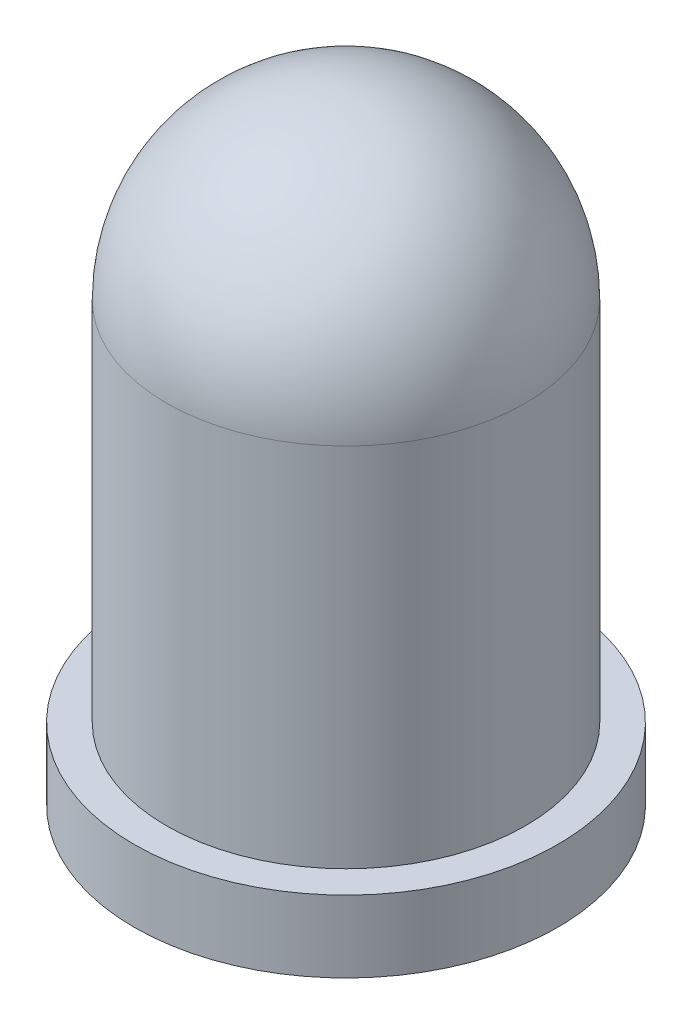
ISO-10303-21;
HEADER;
FILE_DESCRIPTION(('STEP AP214'),'2;1');
FILE_NAME('part.step','',(''),(''),'','','');
FILE_SCHEMA(('AUTOMOTIVE_DESIGN { 1 0 10303 214 1 1 1 1 }'));
ENDSEC;
DATA;
#1=APPLICATION_CONTEXT('core data for automotive mechanical design processes');
#2=APPLICATION_PROTOCOL_DEFINITION('international standard','automotive_design',2000,#1);
#3=PRODUCT_CONTEXT('',#1,'mechanical');
#4=PRODUCT('Part','Part','',(#3));
#5=PRODUCT_RELATED_PRODUCT_CATEGORY('part','',(#4));
#6=PRODUCT_DEFINITION_FORMATION('','',#4);
#7=PRODUCT_DEFINITION_CONTEXT('part definition',#1,'design');
#8=PRODUCT_DEFINITION('design','',#6,#7);
#9=PRODUCT_DEFINITION_SHAPE('','',#8);
#10=(LENGTH_UNIT() NAMED_UNIT(*) SI_UNIT(.MILLI.,.METRE.));
#11=(NAMED_UNIT(*) PLANE_ANGLE_UNIT() SI_UNIT($,.RADIAN.));
#12=(NAMED_UNIT(*) SI_UNIT($,.STERADIAN.) SOLID_ANGLE_UNIT());
#13=UNCERTAINTY_MEASURE_WITH_UNIT(LENGTH_MEASURE(1.E-05),#10,'distance_accuracy_value','');
#14=(GEOMETRIC_REPRESENTATION_CONTEXT(3) GLOBAL_UNCERTAINTY_ASSIGNED_CONTEXT((#13)) GLOBAL_UNIT_ASSIGNED_CONTEXT((#10,
#11,#12)) REPRESENTATION_CONTEXT('',''));
#15=CARTESIAN_POINT('',(0.,0.,0.));
#16=DIRECTION('',(0.,0.,1.));
#17=DIRECTION('',(1.,0.,0.));
#18=AXIS2_PLACEMENT_3D('',#15,#16,#17);
#19=CARTESIAN_POINT('',(0.,8.6,0.));
#20=DIRECTION('',(0.,1.,0.));
#21=DIRECTION('',(0.,0.,1.));
#22=AXIS2_PLACEMENT_3D('',#19,#20,#21);
#23=CYLINDRICAL_SURFACE('',#22,2.5);
#24=CARTESIAN_POINT('',(0.,6.1,0.));
#25=DIRECTION('',(0.,1.,0.));
#26=DIRECTION('',(0.,0.,1.));
#27=AXIS2_PLACEMENT_3D('',#24,#25,#26);
#28=CIRCLE('',#27,2.5);
#29=CARTESIAN_POINT('',(0.,6.1,2.5));
#30=VERTEX_POINT('',#29);
#31=EDGE_CURVE('E68',#30,#30,#28,.T.);
#32=ORIENTED_EDGE('',*,*,#31,.F.);
#33=EDGE_LOOP('',(#32));
#34=FACE_BOUND('',#33,.T.);
#35=CARTESIAN_POINT('',(0.,1.,0.));
#36=DIRECTION('',(0.,1.,0.));
#37=DIRECTION('',(0.,0.,1.));
#38=AXIS2_PLACEMENT_3D('',#35,#36,#37);
#39=CIRCLE('',#38,2.5);
#40=CARTESIAN_POINT('',(0.,1.,2.5));
#41=VERTEX_POINT('',#40);
#42=EDGE_CURVE('E12',#41,#41,#39,.T.);
#43=ORIENTED_EDGE('',*,*,#42,.T.);
#44=EDGE_LOOP('',(#43));
#45=FACE_BOUND('',#44,.T.);
#46=ADVANCED_FACE('F50',(#34,#45),#23,.T.);
#47=CARTESIAN_POINT('',(0.,1.,-2.5));
#48=DIRECTION('',(0.,-1.,0.));
#49=DIRECTION('',(0.,0.,-1.));
#50=AXIS2_PLACEMENT_3D('',#47,#48,#49);
#51=PLANE('',#50);
#52=ORIENTED_EDGE('',*,*,#42,.F.);
#53=EDGE_LOOP('',(#52));
#54=FACE_BOUND('',#53,.T.);
#55=CARTESIAN_POINT('',(0.,1.,0.));
#56=DIRECTION('',(0.,1.,0.));
#57=DIRECTION('',(0.,0.,1.));
#58=AXIS2_PLACEMENT_3D('',#55,#56,#57);
#59=CIRCLE('',#58,2.95);
#60=CARTESIAN_POINT('',(0.,1.,2.95));
#61=VERTEX_POINT('',#60);
#62=EDGE_CURVE('E57',#61,#61,#59,.T.);
#63=ORIENTED_EDGE('',*,*,#62,.T.);
#64=EDGE_LOOP('',(#63));
#65=FACE_BOUND('',#64,.T.);
#66=ADVANCED_FACE('F77',(#54,#65),#51,.F.);
#67=CARTESIAN_POINT('',(0.,8.6,0.));
#68=DIRECTION('',(0.,1.,0.));
#69=DIRECTION('',(0.,0.,1.));
#70=AXIS2_PLACEMENT_3D('',#67,#68,#69);
#71=CYLINDRICAL_SURFACE('',#70,2.95);
#72=ORIENTED_EDGE('',*,*,#62,.F.);
#73=EDGE_LOOP('',(#72));
#74=FACE_BOUND('',#73,.T.);
#75=CARTESIAN_POINT('',(0.,0.,0.));
#76=DIRECTION('',(0.,1.,0.));
#77=DIRECTION('',(0.,0.,1.));
#78=AXIS2_PLACEMENT_3D('',#75,#76,#77);
#79=CIRCLE('',#78,2.95);
#80=CARTESIAN_POINT('',(0.,0.,2.95));
#81=VERTEX_POINT('',#80);
#82=EDGE_CURVE('E63',#81,#81,#79,.T.);
#83=ORIENTED_EDGE('',*,*,#82,.T.);
#84=EDGE_LOOP('',(#83));
#85=FACE_BOUND('',#84,.T.);
#86=ADVANCED_FACE('F81',(#74,#85),#71,.T.);
#87=CARTESIAN_POINT('',(0.,0.,0.));
#88=DIRECTION('',(0.,1.,0.));
#89=DIRECTION('',(0.,0.,1.));
#90=AXIS2_PLACEMENT_3D('',#87,#88,#89);
#91=PLANE('',#90);
#92=ORIENTED_EDGE('',*,*,#82,.F.);
#93=EDGE_LOOP('',(#92));
#94=FACE_BOUND('',#93,.T.);
#95=ADVANCED_FACE('F86',(#94),#91,.F.);
#96=CARTESIAN_POINT('',(0.,6.1,0.));
#97=DIRECTION('',(0.,1.,0.));
#98=DIRECTION('',(0.,0.,-1.));
#99=AXIS2_PLACEMENT_3D('',#96,#97,#98);
#100=SPHERICAL_SURFACE('',#99,2.5);
#101=ORIENTED_EDGE('',*,*,#31,.T.);
#102=EDGE_LOOP('',(#101));
#103=FACE_BOUND('',#102,.T.);
#104=ADVANCED_FACE('F74',(#103),#100,.T.);
#105=CLOSED_SHELL('',(#46,#66,#86,#95,#104));
#106=MANIFOLD_SOLID_BREP('B2',#105);
#107=ADVANCED_BREP_SHAPE_REPRESENTATION('',(#18,#106),#14);
#108=SHAPE_DEFINITION_REPRESENTATION(#9,#107);
ENDSEC;
END-ISO-10303-21;
